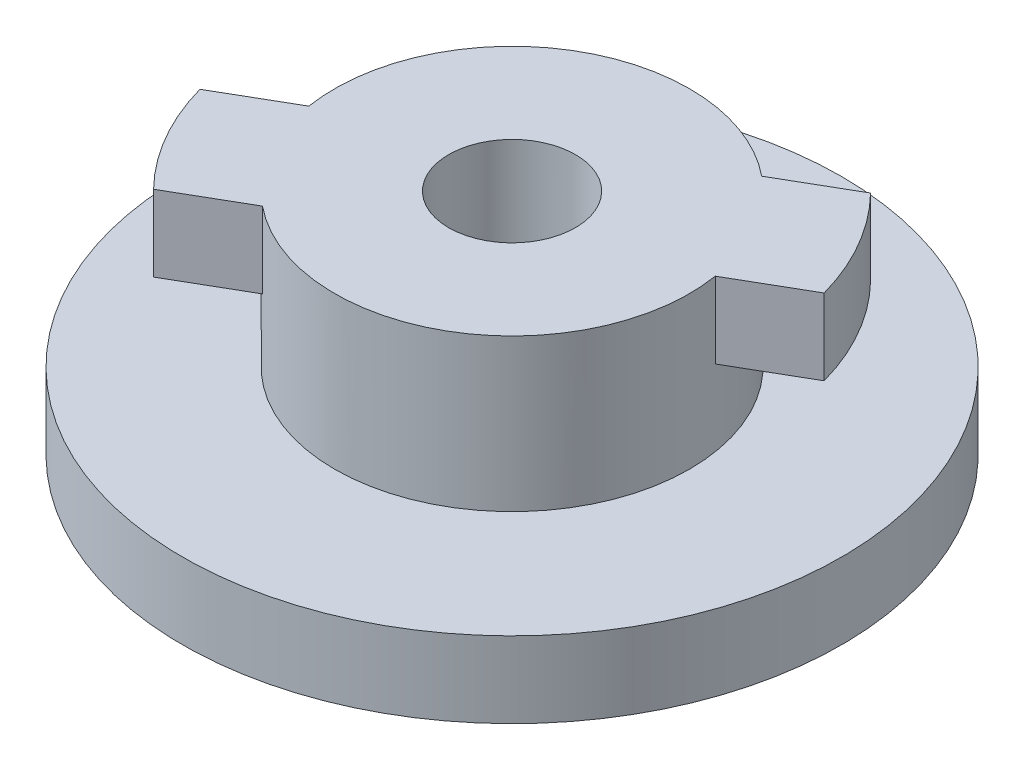
ISO-10303-21;
HEADER;
FILE_DESCRIPTION(('STEP AP214'),'2;1');
FILE_NAME('part.step','',(''),(''),'','','');
FILE_SCHEMA(('AUTOMOTIVE_DESIGN { 1 0 10303 214 1 1 1 1 }'));
ENDSEC;
DATA;
#1=APPLICATION_CONTEXT('core data for automotive mechanical design processes');
#2=APPLICATION_PROTOCOL_DEFINITION('international standard','automotive_design',2000,#1);
#3=PRODUCT_CONTEXT('',#1,'mechanical');
#4=PRODUCT('Part','Part','',(#3));
#5=PRODUCT_RELATED_PRODUCT_CATEGORY('part','',(#4));
#6=PRODUCT_DEFINITION_FORMATION('','',#4);
#7=PRODUCT_DEFINITION_CONTEXT('part definition',#1,'design');
#8=PRODUCT_DEFINITION('design','',#6,#7);
#9=PRODUCT_DEFINITION_SHAPE('','',#8);
#10=(LENGTH_UNIT() NAMED_UNIT(*) SI_UNIT(.MILLI.,.METRE.));
#11=(NAMED_UNIT(*) PLANE_ANGLE_UNIT() SI_UNIT($,.RADIAN.));
#12=(NAMED_UNIT(*) SI_UNIT($,.STERADIAN.) SOLID_ANGLE_UNIT());
#13=UNCERTAINTY_MEASURE_WITH_UNIT(LENGTH_MEASURE(1.E-05),#10,'distance_accuracy_value','');
#14=(GEOMETRIC_REPRESENTATION_CONTEXT(3) GLOBAL_UNCERTAINTY_ASSIGNED_CONTEXT((#13)) GLOBAL_UNIT_ASSIGNED_CONTEXT((#10,
#11,#12)) REPRESENTATION_CONTEXT('',''));
#15=CARTESIAN_POINT('',(0.,0.,0.));
#16=DIRECTION('',(0.,0.,1.));
#17=DIRECTION('',(1.,0.,0.));
#18=AXIS2_PLACEMENT_3D('',#15,#16,#17);
#19=CARTESIAN_POINT('',(0.,0.,-63.0940107675848));
#20=DIRECTION('',(0.,1.,0.));
#21=DIRECTION('',(0.,0.,1.));
#22=AXIS2_PLACEMENT_3D('',#19,#20,#21);
#23=PLANE('',#22);
#24=CARTESIAN_POINT('',(0.,0.,-63.0940107675848));
#25=DIRECTION('',(0.,-1.,0.));
#26=DIRECTION('',(0.,0.,-1.));
#27=AXIS2_PLACEMENT_3D('',#24,#25,#26);
#28=CIRCLE('',#27,7.);
#29=CARTESIAN_POINT('',(4.41237582645303,0.,-68.5282484847015));
#30=VERTEX_POINT('',#29);
#31=CARTESIAN_POINT('',(6.9123758264531,0.,-64.1981214657793));
#32=VERTEX_POINT('',#31);
#33=EDGE_CURVE('E58',#30,#32,#28,.T.);
#34=ORIENTED_EDGE('',*,*,#33,.F.);
#35=DIRECTION('',(-0.866025403784449,0.,0.499999999999982));
#36=VECTOR('',#35,1.);
#37=CARTESIAN_POINT('',(4.41237582645303,0.,-68.5282484847015));
#38=LINE('',#37,#36);
#39=CARTESIAN_POINT('',(7.13525491562421,0.,-70.1003034598052));
#40=VERTEX_POINT('',#39);
#41=EDGE_CURVE('E147',#40,#30,#38,.T.);
#42=ORIENTED_EDGE('',*,*,#41,.F.);
#43=CARTESIAN_POINT('',(0.,0.,-63.0940107675848));
#44=DIRECTION('',(0.,1.,0.));
#45=DIRECTION('',(0.,0.,1.));
#46=AXIS2_PLACEMENT_3D('',#43,#44,#45);
#47=CIRCLE('',#46,9.99999999999993);
#48=CARTESIAN_POINT('',(9.63525491562418,0.,-65.770176440883));
#49=VERTEX_POINT('',#48);
#50=EDGE_CURVE('E143',#49,#40,#47,.T.);
#51=ORIENTED_EDGE('',*,*,#50,.F.);
#52=DIRECTION('',(0.866025403784446,0.,-0.499999999999986));
#53=VECTOR('',#52,1.);
#54=CARTESIAN_POINT('',(6.91237582645297,0.,-64.1981214657793));
#55=LINE('',#54,#53);
#56=EDGE_CURVE('E140',#32,#49,#55,.T.);
#57=ORIENTED_EDGE('',*,*,#56,.F.);
#58=EDGE_LOOP('',(#34,#42,#51,#57));
#59=FACE_BOUND('',#58,.T.);
#60=ADVANCED_FACE('F45',(#59),#23,.F.);
#61=CARTESIAN_POINT('',(-4.41237582645305,0.,-57.6597730504683));
#62=VERTEX_POINT('',#61);
#63=CARTESIAN_POINT('',(-6.91237582645303,0.,-61.9899000693905));
#64=VERTEX_POINT('',#63);
#65=EDGE_CURVE('E11',#62,#64,#28,.T.);
#66=ORIENTED_EDGE('',*,*,#65,.F.);
#67=DIRECTION('',(0.866025403784443,0.,-0.499999999999993));
#68=VECTOR('',#67,1.);
#69=CARTESIAN_POINT('',(-4.41237582645305,0.,-57.6597730504683));
#70=LINE('',#69,#68);
#71=CARTESIAN_POINT('',(-7.13525491562422,0.,-56.0877180753645));
#72=VERTEX_POINT('',#71);
#73=EDGE_CURVE('E155',#72,#62,#70,.T.);
#74=ORIENTED_EDGE('',*,*,#73,.F.);
#75=CARTESIAN_POINT('',(0.,0.,-63.0940107675848));
#76=DIRECTION('',(0.,1.,0.));
#77=DIRECTION('',(0.,0.,1.));
#78=AXIS2_PLACEMENT_3D('',#75,#76,#77);
#79=CIRCLE('',#78,10.);
#80=CARTESIAN_POINT('',(-9.63525491562419,0.,-60.4178450942867));
#81=VERTEX_POINT('',#80);
#82=EDGE_CURVE('E93',#81,#72,#79,.T.);
#83=ORIENTED_EDGE('',*,*,#82,.F.);
#84=DIRECTION('',(-0.866025403784443,0.,0.499999999999993));
#85=VECTOR('',#84,1.);
#86=CARTESIAN_POINT('',(-6.91237582645303,0.,-61.9899000693905));
#87=LINE('',#86,#85);
#88=EDGE_CURVE('E86',#64,#81,#87,.T.);
#89=ORIENTED_EDGE('',*,*,#88,.F.);
#90=EDGE_LOOP('',(#66,#74,#83,#89));
#91=FACE_BOUND('',#90,.T.);
#92=ADVANCED_FACE('F257',(#91),#23,.F.);
#93=CARTESIAN_POINT('',(6.91237582645297,3.,-64.1981214657793));
#94=DIRECTION('',(-0.499999999999986,0.,-0.866025403784446));
#95=DIRECTION('',(-0.866025403784447,0.,0.499999999999986));
#96=AXIS2_PLACEMENT_3D('',#93,#94,#95);
#97=PLANE('',#96);
#98=ORIENTED_EDGE('',*,*,#56,.T.);
#99=DIRECTION('',(0.,-1.,0.));
#100=VECTOR('',#99,1.);
#101=CARTESIAN_POINT('',(9.63525491562418,3.,-65.770176440883));
#102=LINE('',#101,#100);
#103=CARTESIAN_POINT('',(9.63525491562418,3.,-65.770176440883));
#104=VERTEX_POINT('',#103);
#105=EDGE_CURVE('E175',#104,#49,#102,.T.);
#106=ORIENTED_EDGE('',*,*,#105,.F.);
#107=DIRECTION('',(0.866025403784446,0.,-0.499999999999986));
#108=VECTOR('',#107,1.);
#109=CARTESIAN_POINT('',(6.91237582645297,3.,-64.1981214657793));
#110=LINE('',#109,#108);
#111=CARTESIAN_POINT('',(6.91237582645297,3.,-64.1981214657793));
#112=VERTEX_POINT('',#111);
#113=EDGE_CURVE('E102',#112,#104,#110,.T.);
#114=ORIENTED_EDGE('',*,*,#113,.F.);
#115=DIRECTION('',(0.,-1.,0.));
#116=VECTOR('',#115,1.);
#117=CARTESIAN_POINT('',(6.91237582645297,3.,-64.1981214657793));
#118=LINE('',#117,#116);
#119=EDGE_CURVE('E56',#112,#32,#118,.T.);
#120=ORIENTED_EDGE('',*,*,#119,.T.);
#121=EDGE_LOOP('',(#98,#106,#114,#120));
#122=FACE_BOUND('',#121,.T.);
#123=ADVANCED_FACE('F47',(#122),#97,.F.);
#124=CARTESIAN_POINT('',(0.,3.,-63.0940107675848));
#125=DIRECTION('',(0.,-1.,0.));
#126=DIRECTION('',(0.,0.,-1.));
#127=AXIS2_PLACEMENT_3D('',#124,#125,#126);
#128=CYLINDRICAL_SURFACE('',#127,9.99999999999993);
#129=ORIENTED_EDGE('',*,*,#50,.T.);
#130=DIRECTION('',(0.,-1.,0.));
#131=VECTOR('',#130,1.);
#132=CARTESIAN_POINT('',(7.13525491562421,3.,-70.1003034598052));
#133=LINE('',#132,#131);
#134=CARTESIAN_POINT('',(7.13525491562421,3.,-70.1003034598052));
#135=VERTEX_POINT('',#134);
#136=EDGE_CURVE('E171',#135,#40,#133,.T.);
#137=ORIENTED_EDGE('',*,*,#136,.F.);
#138=CARTESIAN_POINT('',(0.,3.,-63.0940107675848));
#139=DIRECTION('',(0.,1.,0.));
#140=DIRECTION('',(0.,0.,1.));
#141=AXIS2_PLACEMENT_3D('',#138,#139,#140);
#142=CIRCLE('',#141,9.99999999999993);
#143=EDGE_CURVE('E204',#104,#135,#142,.T.);
#144=ORIENTED_EDGE('',*,*,#143,.F.);
#145=ORIENTED_EDGE('',*,*,#105,.T.);
#146=EDGE_LOOP('',(#129,#137,#144,#145));
#147=FACE_BOUND('',#146,.T.);
#148=ADVANCED_FACE('F197',(#147),#128,.T.);
#149=CARTESIAN_POINT('',(4.41237582645303,3.,-68.5282484847015));
#150=DIRECTION('',(0.499999999999982,0.,0.866025403784449));
#151=DIRECTION('',(0.866025403784449,0.,-0.499999999999982));
#152=AXIS2_PLACEMENT_3D('',#149,#150,#151);
#153=PLANE('',#152);
#154=ORIENTED_EDGE('',*,*,#41,.T.);
#155=DIRECTION('',(0.,-1.,0.));
#156=VECTOR('',#155,1.);
#157=CARTESIAN_POINT('',(4.41237582645303,3.,-68.5282484847015));
#158=LINE('',#157,#156);
#159=CARTESIAN_POINT('',(4.41237582645303,3.,-68.5282484847015));
#160=VERTEX_POINT('',#159);
#161=EDGE_CURVE('E167',#160,#30,#158,.T.);
#162=ORIENTED_EDGE('',*,*,#161,.F.);
#163=DIRECTION('',(-0.866025403784449,0.,0.499999999999982));
#164=VECTOR('',#163,1.);
#165=CARTESIAN_POINT('',(4.41237582645303,3.,-68.5282484847015));
#166=LINE('',#165,#164);
#167=EDGE_CURVE('E202',#135,#160,#166,.T.);
#168=ORIENTED_EDGE('',*,*,#167,.F.);
#169=ORIENTED_EDGE('',*,*,#136,.T.);
#170=EDGE_LOOP('',(#154,#162,#168,#169));
#171=FACE_BOUND('',#170,.T.);
#172=ADVANCED_FACE('F201',(#171),#153,.F.);
#173=CARTESIAN_POINT('',(0.,3.,-63.0940107675848));
#174=DIRECTION('',(0.,-1.,0.));
#175=DIRECTION('',(0.,0.,-1.));
#176=AXIS2_PLACEMENT_3D('',#173,#174,#175);
#177=CYLINDRICAL_SURFACE('',#176,6.99999999999999);
#178=ORIENTED_EDGE('',*,*,#161,.T.);
#179=ORIENTED_EDGE('',*,*,#33,.T.);
#180=ORIENTED_EDGE('',*,*,#119,.F.);
#181=CARTESIAN_POINT('',(0.,3.,-63.0940107675848));
#182=DIRECTION('',(0.,1.,0.));
#183=DIRECTION('',(0.,0.,1.));
#184=AXIS2_PLACEMENT_3D('',#181,#182,#183);
#185=CIRCLE('',#184,6.99999999999993);
#186=CARTESIAN_POINT('',(-4.41237582645305,3.,-57.6597730504683));
#187=VERTEX_POINT('',#186);
#188=EDGE_CURVE('E159',#187,#112,#185,.T.);
#189=ORIENTED_EDGE('',*,*,#188,.F.);
#190=DIRECTION('',(0.,-1.,0.));
#191=VECTOR('',#190,1.);
#192=CARTESIAN_POINT('',(-4.41237582645305,3.,-57.6597730504683));
#193=LINE('',#192,#191);
#194=EDGE_CURVE('E136',#187,#62,#193,.T.);
#195=ORIENTED_EDGE('',*,*,#194,.T.);
#196=ORIENTED_EDGE('',*,*,#65,.T.);
#197=DIRECTION('',(0.,-1.,0.));
#198=VECTOR('',#197,1.);
#199=CARTESIAN_POINT('',(-6.91237582645303,3.,-61.9899000693905));
#200=LINE('',#199,#198);
#201=CARTESIAN_POINT('',(-6.91237582645303,3.,-61.9899000693905));
#202=VERTEX_POINT('',#201);
#203=EDGE_CURVE('E129',#202,#64,#200,.T.);
#204=ORIENTED_EDGE('',*,*,#203,.F.);
#205=CARTESIAN_POINT('',(0.,3.,-63.0940107675848));
#206=DIRECTION('',(0.,1.,0.));
#207=DIRECTION('',(0.,0.,1.));
#208=AXIS2_PLACEMENT_3D('',#205,#206,#207);
#209=CIRCLE('',#208,6.99999999999999);
#210=EDGE_CURVE('E122',#160,#202,#209,.T.);
#211=ORIENTED_EDGE('',*,*,#210,.F.);
#212=EDGE_LOOP('',(#178,#179,#180,#189,#195,#196,#204,#211));
#213=FACE_BOUND('',#212,.T.);
#214=CARTESIAN_POINT('',(0.,-3.,-63.0940107675848));
#215=DIRECTION('',(0.,-1.,0.));
#216=DIRECTION('',(0.,0.,-1.));
#217=AXIS2_PLACEMENT_3D('',#214,#215,#216);
#218=CIRCLE('',#217,7.);
#219=CARTESIAN_POINT('',(0.,-3.,-70.0940107675848));
#220=VERTEX_POINT('',#219);
#221=EDGE_CURVE('E144',#220,#220,#218,.T.);
#222=ORIENTED_EDGE('',*,*,#221,.F.);
#223=EDGE_LOOP('',(#222));
#224=FACE_BOUND('',#223,.T.);
#225=ADVANCED_FACE('F186',(#213,#224),#177,.T.);
#226=CARTESIAN_POINT('',(-6.91237582645303,3.,-61.9899000693905));
#227=DIRECTION('',(0.499999999999993,0.,0.866025403784443));
#228=DIRECTION('',(0.866025403784443,0.,-0.499999999999993));
#229=AXIS2_PLACEMENT_3D('',#226,#227,#228);
#230=PLANE('',#229);
#231=ORIENTED_EDGE('',*,*,#88,.T.);
#232=DIRECTION('',(0.,-1.,0.));
#233=VECTOR('',#232,1.);
#234=CARTESIAN_POINT('',(-9.63525491562419,3.,-60.4178450942867));
#235=LINE('',#234,#233);
#236=CARTESIAN_POINT('',(-9.63525491562419,3.,-60.4178450942867));
#237=VERTEX_POINT('',#236);
#238=EDGE_CURVE('E126',#237,#81,#235,.T.);
#239=ORIENTED_EDGE('',*,*,#238,.F.);
#240=DIRECTION('',(-0.866025403784443,0.,0.499999999999993));
#241=VECTOR('',#240,1.);
#242=CARTESIAN_POINT('',(-6.91237582645303,3.,-61.9899000693905));
#243=LINE('',#242,#241);
#244=EDGE_CURVE('E117',#202,#237,#243,.T.);
#245=ORIENTED_EDGE('',*,*,#244,.F.);
#246=ORIENTED_EDGE('',*,*,#203,.T.);
#247=EDGE_LOOP('',(#231,#239,#245,#246));
#248=FACE_BOUND('',#247,.T.);
#249=ADVANCED_FACE('F127',(#248),#230,.F.);
#250=CARTESIAN_POINT('',(0.,3.,-63.0940107675848));
#251=DIRECTION('',(0.,-1.,0.));
#252=DIRECTION('',(0.,0.,-1.));
#253=AXIS2_PLACEMENT_3D('',#250,#251,#252);
#254=CYLINDRICAL_SURFACE('',#253,10.);
#255=ORIENTED_EDGE('',*,*,#82,.T.);
#256=DIRECTION('',(0.,-1.,0.));
#257=VECTOR('',#256,1.);
#258=CARTESIAN_POINT('',(-7.13525491562422,3.,-56.0877180753645));
#259=LINE('',#258,#257);
#260=CARTESIAN_POINT('',(-7.13525491562422,3.,-56.0877180753645));
#261=VERTEX_POINT('',#260);
#262=EDGE_CURVE('E130',#261,#72,#259,.T.);
#263=ORIENTED_EDGE('',*,*,#262,.F.);
#264=CARTESIAN_POINT('',(0.,3.,-63.0940107675848));
#265=DIRECTION('',(0.,1.,0.));
#266=DIRECTION('',(0.,0.,1.));
#267=AXIS2_PLACEMENT_3D('',#264,#265,#266);
#268=CIRCLE('',#267,10.);
#269=EDGE_CURVE('E120',#237,#261,#268,.T.);
#270=ORIENTED_EDGE('',*,*,#269,.F.);
#271=ORIENTED_EDGE('',*,*,#238,.T.);
#272=EDGE_LOOP('',(#255,#263,#270,#271));
#273=FACE_BOUND('',#272,.T.);
#274=ADVANCED_FACE('F132',(#273),#254,.T.);
#275=CARTESIAN_POINT('',(-4.41237582645305,3.,-57.6597730504683));
#276=DIRECTION('',(-0.499999999999992,0.,-0.866025403784443));
#277=DIRECTION('',(-0.866025403784443,0.,0.499999999999993));
#278=AXIS2_PLACEMENT_3D('',#275,#276,#277);
#279=PLANE('',#278);
#280=ORIENTED_EDGE('',*,*,#73,.T.);
#281=ORIENTED_EDGE('',*,*,#194,.F.);
#282=DIRECTION('',(0.866025403784443,0.,-0.499999999999993));
#283=VECTOR('',#282,1.);
#284=CARTESIAN_POINT('',(-4.41237582645305,3.,-57.6597730504683));
#285=LINE('',#284,#283);
#286=EDGE_CURVE('E66',#261,#187,#285,.T.);
#287=ORIENTED_EDGE('',*,*,#286,.F.);
#288=ORIENTED_EDGE('',*,*,#262,.T.);
#289=EDGE_LOOP('',(#280,#281,#287,#288));
#290=FACE_BOUND('',#289,.T.);
#291=ADVANCED_FACE('F266',(#290),#279,.F.);
#292=CARTESIAN_POINT('',(0.,3.,-63.0940107675848));
#293=DIRECTION('',(0.,1.,0.));
#294=DIRECTION('',(0.,0.,1.));
#295=AXIS2_PLACEMENT_3D('',#292,#293,#294);
#296=PLANE('',#295);
#297=CARTESIAN_POINT('',(0.,3.,-63.0940107675848));
#298=DIRECTION('',(0.,1.,0.));
#299=DIRECTION('',(0.,0.,1.));
#300=AXIS2_PLACEMENT_3D('',#297,#298,#299);
#301=CIRCLE('',#300,2.5);
#302=CARTESIAN_POINT('',(0.,3.,-60.5940107675848));
#303=VERTEX_POINT('',#302);
#304=EDGE_CURVE('E224',#303,#303,#301,.T.);
#305=ORIENTED_EDGE('',*,*,#304,.F.);
#306=EDGE_LOOP('',(#305));
#307=FACE_BOUND('',#306,.T.);
#308=ORIENTED_EDGE('',*,*,#188,.T.);
#309=ORIENTED_EDGE('',*,*,#113,.T.);
#310=ORIENTED_EDGE('',*,*,#143,.T.);
#311=ORIENTED_EDGE('',*,*,#167,.T.);
#312=ORIENTED_EDGE('',*,*,#210,.T.);
#313=ORIENTED_EDGE('',*,*,#244,.T.);
#314=ORIENTED_EDGE('',*,*,#269,.T.);
#315=ORIENTED_EDGE('',*,*,#286,.T.);
#316=EDGE_LOOP('',(#308,#309,#310,#311,#312,#313,#314,#315));
#317=FACE_BOUND('',#316,.T.);
#318=ADVANCED_FACE('F118',(#307,#317),#296,.T.);
#319=CARTESIAN_POINT('',(0.,-6.,-63.0940107675848));
#320=DIRECTION('',(0.,1.,0.));
#321=DIRECTION('',(0.,0.,1.));
#322=AXIS2_PLACEMENT_3D('',#319,#320,#321);
#323=CYLINDRICAL_SURFACE('',#322,13.);
#324=CARTESIAN_POINT('',(0.,-6.,-63.0940107675848));
#325=DIRECTION('',(0.,-1.,0.));
#326=DIRECTION('',(0.,0.,-1.));
#327=AXIS2_PLACEMENT_3D('',#324,#325,#326);
#328=CIRCLE('',#327,13.);
#329=CARTESIAN_POINT('',(0.,-6.,-76.0940107675848));
#330=VERTEX_POINT('',#329);
#331=EDGE_CURVE('E193',#330,#330,#328,.T.);
#332=ORIENTED_EDGE('',*,*,#331,.F.);
#333=EDGE_LOOP('',(#332));
#334=FACE_BOUND('',#333,.T.);
#335=CARTESIAN_POINT('',(0.,-3.,-63.0940107675848));
#336=DIRECTION('',(0.,-1.,0.));
#337=DIRECTION('',(0.,0.,-1.));
#338=AXIS2_PLACEMENT_3D('',#335,#336,#337);
#339=CIRCLE('',#338,13.);
#340=CARTESIAN_POINT('',(0.,-3.,-76.0940107675848));
#341=VERTEX_POINT('',#340);
#342=EDGE_CURVE('E217',#341,#341,#339,.T.);
#343=ORIENTED_EDGE('',*,*,#342,.T.);
#344=EDGE_LOOP('',(#343));
#345=FACE_BOUND('',#344,.T.);
#346=ADVANCED_FACE('F239',(#334,#345),#323,.T.);
#347=CARTESIAN_POINT('',(0.,-6.,-63.0940107675848));
#348=DIRECTION('',(0.,-1.,0.));
#349=DIRECTION('',(0.,0.,-1.));
#350=AXIS2_PLACEMENT_3D('',#347,#348,#349);
#351=PLANE('',#350);
#352=CARTESIAN_POINT('',(0.,-6.,-63.0940107675848));
#353=DIRECTION('',(0.,-1.,0.));
#354=DIRECTION('',(0.,0.,-1.));
#355=AXIS2_PLACEMENT_3D('',#352,#353,#354);
#356=CIRCLE('',#355,2.5);
#357=CARTESIAN_POINT('',(0.,-6.,-65.5940107675848));
#358=VERTEX_POINT('',#357);
#359=EDGE_CURVE('E49',#358,#358,#356,.T.);
#360=ORIENTED_EDGE('',*,*,#359,.F.);
#361=EDGE_LOOP('',(#360));
#362=FACE_BOUND('',#361,.T.);
#363=ORIENTED_EDGE('',*,*,#331,.T.);
#364=EDGE_LOOP('',(#363));
#365=FACE_BOUND('',#364,.T.);
#366=ADVANCED_FACE('F235',(#362,#365),#351,.T.);
#367=CARTESIAN_POINT('',(0.,-3.,-63.0940107675848));
#368=DIRECTION('',(0.,-1.,0.));
#369=DIRECTION('',(0.,0.,-1.));
#370=AXIS2_PLACEMENT_3D('',#367,#368,#369);
#371=PLANE('',#370);
#372=ORIENTED_EDGE('',*,*,#221,.T.);
#373=EDGE_LOOP('',(#372));
#374=FACE_BOUND('',#373,.T.);
#375=ORIENTED_EDGE('',*,*,#342,.F.);
#376=EDGE_LOOP('',(#375));
#377=FACE_BOUND('',#376,.T.);
#378=ADVANCED_FACE('F238',(#374,#377),#371,.F.);
#379=CARTESIAN_POINT('',(0.,-17.,-63.0940107675848));
#380=DIRECTION('',(0.,1.,0.));
#381=DIRECTION('',(0.,0.,1.));
#382=AXIS2_PLACEMENT_3D('',#379,#380,#381);
#383=CYLINDRICAL_SURFACE('',#382,2.5);
#384=ORIENTED_EDGE('',*,*,#359,.T.);
#385=EDGE_LOOP('',(#384));
#386=FACE_BOUND('',#385,.T.);
#387=ORIENTED_EDGE('',*,*,#304,.T.);
#388=EDGE_LOOP('',(#387));
#389=FACE_BOUND('',#388,.T.);
#390=ADVANCED_FACE('F233',(#386,#389),#383,.F.);
#391=CLOSED_SHELL('',(#60,#92,#123,#148,#172,#225,#249,#274,#291,#318,#346,#366,#378,#390));
#392=MANIFOLD_SOLID_BREP('B2',#391);
#393=ADVANCED_BREP_SHAPE_REPRESENTATION('',(#18,#392),#14);
#394=SHAPE_DEFINITION_REPRESENTATION(#9,#393);
ENDSEC;
END-ISO-10303-21;
